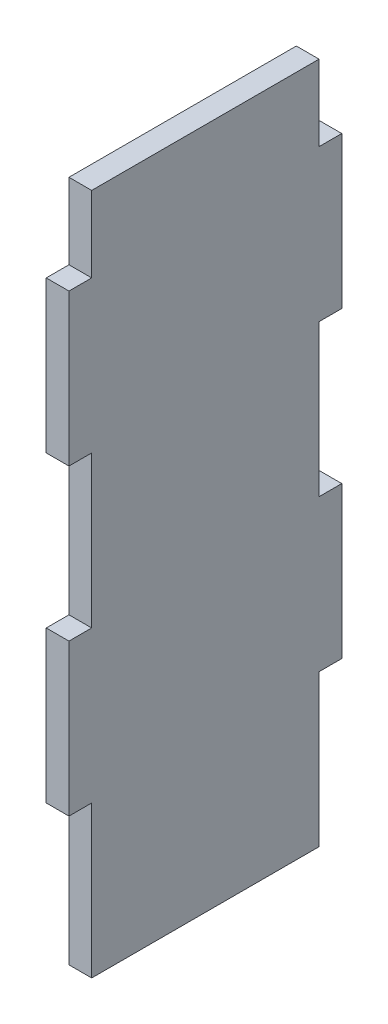
ISO-10303-21;
HEADER;
FILE_DESCRIPTION(('STEP AP214'),'2;1');
FILE_NAME('part.step','',(''),(''),'','','');
FILE_SCHEMA(('AUTOMOTIVE_DESIGN { 1 0 10303 214 1 1 1 1 }'));
ENDSEC;
DATA;
#1=APPLICATION_CONTEXT('core data for automotive mechanical design processes');
#2=APPLICATION_PROTOCOL_DEFINITION('international standard','automotive_design',2000,#1);
#3=PRODUCT_CONTEXT('',#1,'mechanical');
#4=PRODUCT('Part','Part','',(#3));
#5=PRODUCT_RELATED_PRODUCT_CATEGORY('part','',(#4));
#6=PRODUCT_DEFINITION_FORMATION('','',#4);
#7=PRODUCT_DEFINITION_CONTEXT('part definition',#1,'design');
#8=PRODUCT_DEFINITION('design','',#6,#7);
#9=PRODUCT_DEFINITION_SHAPE('','',#8);
#10=(LENGTH_UNIT() NAMED_UNIT(*) SI_UNIT(.MILLI.,.METRE.));
#11=(NAMED_UNIT(*) PLANE_ANGLE_UNIT() SI_UNIT($,.RADIAN.));
#12=(NAMED_UNIT(*) SI_UNIT($,.STERADIAN.) SOLID_ANGLE_UNIT());
#13=UNCERTAINTY_MEASURE_WITH_UNIT(LENGTH_MEASURE(1.E-05),#10,'distance_accuracy_value','');
#14=(GEOMETRIC_REPRESENTATION_CONTEXT(3) GLOBAL_UNCERTAINTY_ASSIGNED_CONTEXT((#13)) GLOBAL_UNIT_ASSIGNED_CONTEXT((#10,
#11,#12)) REPRESENTATION_CONTEXT('',''));
#15=CARTESIAN_POINT('',(0.,0.,0.));
#16=DIRECTION('',(0.,0.,1.));
#17=DIRECTION('',(1.,0.,0.));
#18=AXIS2_PLACEMENT_3D('',#15,#16,#17);
#19=CARTESIAN_POINT('',(3.,0.,-15.));
#20=DIRECTION('',(0.,0.,1.));
#21=DIRECTION('',(1.,0.,0.));
#22=AXIS2_PLACEMENT_3D('',#19,#20,#21);
#23=PLANE('',#22);
#24=DIRECTION('',(0.,1.,0.));
#25=VECTOR('',#24,1.);
#26=CARTESIAN_POINT('',(0.,0.,-15.));
#27=LINE('',#26,#25);
#28=CARTESIAN_POINT('',(0.,0.,-15.));
#29=VERTEX_POINT('',#28);
#30=CARTESIAN_POINT('',(0.,20.,-15.));
#31=VERTEX_POINT('',#30);
#32=EDGE_CURVE('E203',#29,#31,#27,.T.);
#33=ORIENTED_EDGE('',*,*,#32,.T.);
#34=DIRECTION('',(-1.,0.,0.));
#35=VECTOR('',#34,1.);
#36=CARTESIAN_POINT('',(3.,20.,-15.));
#37=LINE('',#36,#35);
#38=CARTESIAN_POINT('',(3.,20.,-15.));
#39=VERTEX_POINT('',#38);
#40=EDGE_CURVE('E11',#39,#31,#37,.T.);
#41=ORIENTED_EDGE('',*,*,#40,.F.);
#42=DIRECTION('',(0.,1.,0.));
#43=VECTOR('',#42,1.);
#44=CARTESIAN_POINT('',(3.,0.,-15.));
#45=LINE('',#44,#43);
#46=CARTESIAN_POINT('',(3.,0.,-15.));
#47=VERTEX_POINT('',#46);
#48=EDGE_CURVE('E241',#47,#39,#45,.T.);
#49=ORIENTED_EDGE('',*,*,#48,.F.);
#50=DIRECTION('',(-1.,0.,0.));
#51=VECTOR('',#50,1.);
#52=CARTESIAN_POINT('',(3.,0.,-15.));
#53=LINE('',#52,#51);
#54=EDGE_CURVE('E199',#47,#29,#53,.T.);
#55=ORIENTED_EDGE('',*,*,#54,.T.);
#56=EDGE_LOOP('',(#33,#41,#49,#55));
#57=FACE_BOUND('',#56,.T.);
#58=ADVANCED_FACE('F35',(#57),#23,.F.);
#59=CARTESIAN_POINT('',(3.,20.,-15.));
#60=DIRECTION('',(0.,1.,0.));
#61=DIRECTION('',(0.,0.,1.));
#62=AXIS2_PLACEMENT_3D('',#59,#60,#61);
#63=PLANE('',#62);
#64=DIRECTION('',(0.,0.,-1.));
#65=VECTOR('',#64,1.);
#66=CARTESIAN_POINT('',(0.,20.,-15.));
#67=LINE('',#66,#65);
#68=CARTESIAN_POINT('',(0.,20.,-18.));
#69=VERTEX_POINT('',#68);
#70=EDGE_CURVE('E206',#31,#69,#67,.T.);
#71=ORIENTED_EDGE('',*,*,#70,.T.);
#72=DIRECTION('',(-1.,0.,0.));
#73=VECTOR('',#72,1.);
#74=CARTESIAN_POINT('',(3.,20.,-18.));
#75=LINE('',#74,#73);
#76=CARTESIAN_POINT('',(3.,20.,-18.));
#77=VERTEX_POINT('',#76);
#78=EDGE_CURVE('E43',#77,#69,#75,.T.);
#79=ORIENTED_EDGE('',*,*,#78,.F.);
#80=DIRECTION('',(0.,0.,-1.));
#81=VECTOR('',#80,1.);
#82=CARTESIAN_POINT('',(3.,20.,-15.));
#83=LINE('',#82,#81);
#84=EDGE_CURVE('E130',#39,#77,#83,.T.);
#85=ORIENTED_EDGE('',*,*,#84,.F.);
#86=ORIENTED_EDGE('',*,*,#40,.T.);
#87=EDGE_LOOP('',(#71,#79,#85,#86));
#88=FACE_BOUND('',#87,.T.);
#89=ADVANCED_FACE('F359',(#88),#63,.F.);
#90=CARTESIAN_POINT('',(3.,20.,-18.));
#91=DIRECTION('',(0.,0.,1.));
#92=DIRECTION('',(1.,0.,0.));
#93=AXIS2_PLACEMENT_3D('',#90,#91,#92);
#94=PLANE('',#93);
#95=DIRECTION('',(0.,1.,0.));
#96=VECTOR('',#95,1.);
#97=CARTESIAN_POINT('',(0.,20.,-18.));
#98=LINE('',#97,#96);
#99=CARTESIAN_POINT('',(0.,40.,-18.));
#100=VERTEX_POINT('',#99);
#101=EDGE_CURVE('E208',#69,#100,#98,.T.);
#102=ORIENTED_EDGE('',*,*,#101,.T.);
#103=DIRECTION('',(-1.,0.,0.));
#104=VECTOR('',#103,1.);
#105=CARTESIAN_POINT('',(3.,40.,-18.));
#106=LINE('',#105,#104);
#107=CARTESIAN_POINT('',(3.,40.,-18.));
#108=VERTEX_POINT('',#107);
#109=EDGE_CURVE('E284',#108,#100,#106,.T.);
#110=ORIENTED_EDGE('',*,*,#109,.F.);
#111=DIRECTION('',(0.,1.,0.));
#112=VECTOR('',#111,1.);
#113=CARTESIAN_POINT('',(3.,20.,-18.));
#114=LINE('',#113,#112);
#115=EDGE_CURVE('E292',#77,#108,#114,.T.);
#116=ORIENTED_EDGE('',*,*,#115,.F.);
#117=ORIENTED_EDGE('',*,*,#78,.T.);
#118=EDGE_LOOP('',(#102,#110,#116,#117));
#119=FACE_BOUND('',#118,.T.);
#120=ADVANCED_FACE('F290',(#119),#94,.F.);
#121=CARTESIAN_POINT('',(3.,40.,-18.));
#122=DIRECTION('',(0.,-1.,0.));
#123=DIRECTION('',(0.,0.,-1.));
#124=AXIS2_PLACEMENT_3D('',#121,#122,#123);
#125=PLANE('',#124);
#126=DIRECTION('',(0.,0.,1.));
#127=VECTOR('',#126,1.);
#128=CARTESIAN_POINT('',(0.,40.,-18.));
#129=LINE('',#128,#127);
#130=CARTESIAN_POINT('',(0.,40.,-15.));
#131=VERTEX_POINT('',#130);
#132=EDGE_CURVE('E210',#100,#131,#129,.T.);
#133=ORIENTED_EDGE('',*,*,#132,.T.);
#134=DIRECTION('',(-1.,0.,0.));
#135=VECTOR('',#134,1.);
#136=CARTESIAN_POINT('',(3.,40.,-15.));
#137=LINE('',#136,#135);
#138=CARTESIAN_POINT('',(3.,40.,-15.));
#139=VERTEX_POINT('',#138);
#140=EDGE_CURVE('E281',#139,#131,#137,.T.);
#141=ORIENTED_EDGE('',*,*,#140,.F.);
#142=DIRECTION('',(0.,0.,1.));
#143=VECTOR('',#142,1.);
#144=CARTESIAN_POINT('',(3.,40.,-18.));
#145=LINE('',#144,#143);
#146=EDGE_CURVE('E310',#108,#139,#145,.T.);
#147=ORIENTED_EDGE('',*,*,#146,.F.);
#148=ORIENTED_EDGE('',*,*,#109,.T.);
#149=EDGE_LOOP('',(#133,#141,#147,#148));
#150=FACE_BOUND('',#149,.T.);
#151=ADVANCED_FACE('F301',(#150),#125,.F.);
#152=CARTESIAN_POINT('',(3.,40.,-15.));
#153=DIRECTION('',(0.,0.,1.));
#154=DIRECTION('',(0.,-1.,0.));
#155=AXIS2_PLACEMENT_3D('',#152,#153,#154);
#156=PLANE('',#155);
#157=DIRECTION('',(0.,1.,0.));
#158=VECTOR('',#157,1.);
#159=CARTESIAN_POINT('',(0.,40.,-15.));
#160=LINE('',#159,#158);
#161=CARTESIAN_POINT('',(0.,60.,-15.));
#162=VERTEX_POINT('',#161);
#163=EDGE_CURVE('E212',#131,#162,#160,.T.);
#164=ORIENTED_EDGE('',*,*,#163,.T.);
#165=DIRECTION('',(-1.,0.,0.));
#166=VECTOR('',#165,1.);
#167=CARTESIAN_POINT('',(3.,60.,-15.));
#168=LINE('',#167,#166);
#169=CARTESIAN_POINT('',(3.,60.,-15.));
#170=VERTEX_POINT('',#169);
#171=EDGE_CURVE('E278',#170,#162,#168,.T.);
#172=ORIENTED_EDGE('',*,*,#171,.F.);
#173=DIRECTION('',(0.,1.,0.));
#174=VECTOR('',#173,1.);
#175=CARTESIAN_POINT('',(3.,40.,-15.));
#176=LINE('',#175,#174);
#177=EDGE_CURVE('E307',#139,#170,#176,.T.);
#178=ORIENTED_EDGE('',*,*,#177,.F.);
#179=ORIENTED_EDGE('',*,*,#140,.T.);
#180=EDGE_LOOP('',(#164,#172,#178,#179));
#181=FACE_BOUND('',#180,.T.);
#182=ADVANCED_FACE('F305',(#181),#156,.F.);
#183=CARTESIAN_POINT('',(3.,60.,-15.));
#184=DIRECTION('',(0.,1.,0.));
#185=DIRECTION('',(0.,0.,1.));
#186=AXIS2_PLACEMENT_3D('',#183,#184,#185);
#187=PLANE('',#186);
#188=DIRECTION('',(0.,0.,-1.));
#189=VECTOR('',#188,1.);
#190=CARTESIAN_POINT('',(0.,60.,-15.));
#191=LINE('',#190,#189);
#192=CARTESIAN_POINT('',(0.,60.,-18.));
#193=VERTEX_POINT('',#192);
#194=EDGE_CURVE('E214',#162,#193,#191,.T.);
#195=ORIENTED_EDGE('',*,*,#194,.T.);
#196=DIRECTION('',(-1.,0.,0.));
#197=VECTOR('',#196,1.);
#198=CARTESIAN_POINT('',(3.,60.,-18.));
#199=LINE('',#198,#197);
#200=CARTESIAN_POINT('',(3.,60.,-18.));
#201=VERTEX_POINT('',#200);
#202=EDGE_CURVE('E275',#201,#193,#199,.T.);
#203=ORIENTED_EDGE('',*,*,#202,.F.);
#204=DIRECTION('',(0.,0.,-1.));
#205=VECTOR('',#204,1.);
#206=CARTESIAN_POINT('',(3.,60.,-15.));
#207=LINE('',#206,#205);
#208=EDGE_CURVE('E309',#170,#201,#207,.T.);
#209=ORIENTED_EDGE('',*,*,#208,.F.);
#210=ORIENTED_EDGE('',*,*,#171,.T.);
#211=EDGE_LOOP('',(#195,#203,#209,#210));
#212=FACE_BOUND('',#211,.T.);
#213=ADVANCED_FACE('F372',(#212),#187,.F.);
#214=CARTESIAN_POINT('',(3.,60.,-18.));
#215=DIRECTION('',(0.,0.,1.));
#216=DIRECTION('',(1.,0.,0.));
#217=AXIS2_PLACEMENT_3D('',#214,#215,#216);
#218=PLANE('',#217);
#219=DIRECTION('',(0.,1.,0.));
#220=VECTOR('',#219,1.);
#221=CARTESIAN_POINT('',(0.,60.,-18.));
#222=LINE('',#221,#220);
#223=CARTESIAN_POINT('',(0.,80.,-18.));
#224=VERTEX_POINT('',#223);
#225=EDGE_CURVE('E216',#193,#224,#222,.T.);
#226=ORIENTED_EDGE('',*,*,#225,.T.);
#227=DIRECTION('',(-1.,0.,0.));
#228=VECTOR('',#227,1.);
#229=CARTESIAN_POINT('',(3.,80.,-18.));
#230=LINE('',#229,#228);
#231=CARTESIAN_POINT('',(3.,80.,-18.));
#232=VERTEX_POINT('',#231);
#233=EDGE_CURVE('E272',#232,#224,#230,.T.);
#234=ORIENTED_EDGE('',*,*,#233,.F.);
#235=DIRECTION('',(0.,1.,0.));
#236=VECTOR('',#235,1.);
#237=CARTESIAN_POINT('',(3.,60.,-18.));
#238=LINE('',#237,#236);
#239=EDGE_CURVE('E312',#201,#232,#238,.T.);
#240=ORIENTED_EDGE('',*,*,#239,.F.);
#241=ORIENTED_EDGE('',*,*,#202,.T.);
#242=EDGE_LOOP('',(#226,#234,#240,#241));
#243=FACE_BOUND('',#242,.T.);
#244=ADVANCED_FACE('F375',(#243),#218,.F.);
#245=CARTESIAN_POINT('',(3.,80.,-18.));
#246=DIRECTION('',(0.,-1.,0.));
#247=DIRECTION('',(0.,0.,-1.));
#248=AXIS2_PLACEMENT_3D('',#245,#246,#247);
#249=PLANE('',#248);
#250=DIRECTION('',(0.,0.,1.));
#251=VECTOR('',#250,1.);
#252=CARTESIAN_POINT('',(0.,80.,-18.));
#253=LINE('',#252,#251);
#254=CARTESIAN_POINT('',(0.,80.,-15.));
#255=VERTEX_POINT('',#254);
#256=EDGE_CURVE('E218',#224,#255,#253,.T.);
#257=ORIENTED_EDGE('',*,*,#256,.T.);
#258=DIRECTION('',(-1.,0.,0.));
#259=VECTOR('',#258,1.);
#260=CARTESIAN_POINT('',(3.,80.,-15.));
#261=LINE('',#260,#259);
#262=CARTESIAN_POINT('',(3.,80.,-15.));
#263=VERTEX_POINT('',#262);
#264=EDGE_CURVE('E269',#263,#255,#261,.T.);
#265=ORIENTED_EDGE('',*,*,#264,.F.);
#266=DIRECTION('',(0.,0.,1.));
#267=VECTOR('',#266,1.);
#268=CARTESIAN_POINT('',(3.,80.,-18.));
#269=LINE('',#268,#267);
#270=EDGE_CURVE('E318',#232,#263,#269,.T.);
#271=ORIENTED_EDGE('',*,*,#270,.F.);
#272=ORIENTED_EDGE('',*,*,#233,.T.);
#273=EDGE_LOOP('',(#257,#265,#271,#272));
#274=FACE_BOUND('',#273,.T.);
#275=ADVANCED_FACE('F379',(#274),#249,.F.);
#276=CARTESIAN_POINT('',(3.,80.,-15.));
#277=DIRECTION('',(0.,0.,1.));
#278=DIRECTION('',(0.,-1.,0.));
#279=AXIS2_PLACEMENT_3D('',#276,#277,#278);
#280=PLANE('',#279);
#281=DIRECTION('',(0.,1.,0.));
#282=VECTOR('',#281,1.);
#283=CARTESIAN_POINT('',(0.,80.,-15.));
#284=LINE('',#283,#282);
#285=CARTESIAN_POINT('',(0.,90.,-15.));
#286=VERTEX_POINT('',#285);
#287=EDGE_CURVE('E220',#255,#286,#284,.T.);
#288=ORIENTED_EDGE('',*,*,#287,.T.);
#289=DIRECTION('',(-1.,0.,0.));
#290=VECTOR('',#289,1.);
#291=CARTESIAN_POINT('',(3.,90.,-15.));
#292=LINE('',#291,#290);
#293=CARTESIAN_POINT('',(3.,90.,-15.));
#294=VERTEX_POINT('',#293);
#295=EDGE_CURVE('E266',#294,#286,#292,.T.);
#296=ORIENTED_EDGE('',*,*,#295,.F.);
#297=DIRECTION('',(0.,1.,0.));
#298=VECTOR('',#297,1.);
#299=CARTESIAN_POINT('',(3.,80.,-15.));
#300=LINE('',#299,#298);
#301=EDGE_CURVE('E320',#263,#294,#300,.T.);
#302=ORIENTED_EDGE('',*,*,#301,.F.);
#303=ORIENTED_EDGE('',*,*,#264,.T.);
#304=EDGE_LOOP('',(#288,#296,#302,#303));
#305=FACE_BOUND('',#304,.T.);
#306=ADVANCED_FACE('F383',(#305),#280,.F.);
#307=CARTESIAN_POINT('',(3.,90.,-15.));
#308=DIRECTION('',(0.,-1.,0.));
#309=DIRECTION('',(0.,0.,-1.));
#310=AXIS2_PLACEMENT_3D('',#307,#308,#309);
#311=PLANE('',#310);
#312=DIRECTION('',(0.,0.,1.));
#313=VECTOR('',#312,1.);
#314=CARTESIAN_POINT('',(0.,90.,-15.));
#315=LINE('',#314,#313);
#316=CARTESIAN_POINT('',(0.,90.,15.));
#317=VERTEX_POINT('',#316);
#318=EDGE_CURVE('E222',#286,#317,#315,.T.);
#319=ORIENTED_EDGE('',*,*,#318,.T.);
#320=DIRECTION('',(-1.,0.,0.));
#321=VECTOR('',#320,1.);
#322=CARTESIAN_POINT('',(3.,90.,15.));
#323=LINE('',#322,#321);
#324=CARTESIAN_POINT('',(3.,90.,15.));
#325=VERTEX_POINT('',#324);
#326=EDGE_CURVE('E263',#325,#317,#323,.T.);
#327=ORIENTED_EDGE('',*,*,#326,.F.);
#328=DIRECTION('',(0.,0.,1.));
#329=VECTOR('',#328,1.);
#330=CARTESIAN_POINT('',(3.,90.,-15.));
#331=LINE('',#330,#329);
#332=EDGE_CURVE('E322',#294,#325,#331,.T.);
#333=ORIENTED_EDGE('',*,*,#332,.F.);
#334=ORIENTED_EDGE('',*,*,#295,.T.);
#335=EDGE_LOOP('',(#319,#327,#333,#334));
#336=FACE_BOUND('',#335,.T.);
#337=ADVANCED_FACE('F387',(#336),#311,.F.);
#338=CARTESIAN_POINT('',(3.,80.,15.));
#339=DIRECTION('',(0.,0.,-1.));
#340=DIRECTION('',(0.,1.,0.));
#341=AXIS2_PLACEMENT_3D('',#338,#339,#340);
#342=PLANE('',#341);
#343=DIRECTION('',(0.,-1.,0.));
#344=VECTOR('',#343,1.);
#345=CARTESIAN_POINT('',(0.,80.,15.));
#346=LINE('',#345,#344);
#347=CARTESIAN_POINT('',(0.,80.,15.));
#348=VERTEX_POINT('',#347);
#349=EDGE_CURVE('E224',#317,#348,#346,.T.);
#350=ORIENTED_EDGE('',*,*,#349,.T.);
#351=DIRECTION('',(-1.,0.,0.));
#352=VECTOR('',#351,1.);
#353=CARTESIAN_POINT('',(3.,80.,15.));
#354=LINE('',#353,#352);
#355=CARTESIAN_POINT('',(3.,80.,15.));
#356=VERTEX_POINT('',#355);
#357=EDGE_CURVE('E260',#356,#348,#354,.T.);
#358=ORIENTED_EDGE('',*,*,#357,.F.);
#359=DIRECTION('',(0.,-1.,0.));
#360=VECTOR('',#359,1.);
#361=CARTESIAN_POINT('',(3.,80.,15.));
#362=LINE('',#361,#360);
#363=EDGE_CURVE('E324',#325,#356,#362,.T.);
#364=ORIENTED_EDGE('',*,*,#363,.F.);
#365=ORIENTED_EDGE('',*,*,#326,.T.);
#366=EDGE_LOOP('',(#350,#358,#364,#365));
#367=FACE_BOUND('',#366,.T.);
#368=ADVANCED_FACE('F391',(#367),#342,.F.);
#369=CARTESIAN_POINT('',(3.,80.,18.));
#370=DIRECTION('',(0.,-1.,0.));
#371=DIRECTION('',(0.,0.,-1.));
#372=AXIS2_PLACEMENT_3D('',#369,#370,#371);
#373=PLANE('',#372);
#374=DIRECTION('',(0.,0.,1.));
#375=VECTOR('',#374,1.);
#376=CARTESIAN_POINT('',(0.,80.,18.));
#377=LINE('',#376,#375);
#378=CARTESIAN_POINT('',(0.,80.,18.));
#379=VERTEX_POINT('',#378);
#380=EDGE_CURVE('E226',#348,#379,#377,.T.);
#381=ORIENTED_EDGE('',*,*,#380,.T.);
#382=DIRECTION('',(-1.,0.,0.));
#383=VECTOR('',#382,1.);
#384=CARTESIAN_POINT('',(3.,80.,18.));
#385=LINE('',#384,#383);
#386=CARTESIAN_POINT('',(3.,80.,18.));
#387=VERTEX_POINT('',#386);
#388=EDGE_CURVE('E257',#387,#379,#385,.T.);
#389=ORIENTED_EDGE('',*,*,#388,.F.);
#390=DIRECTION('',(0.,0.,1.));
#391=VECTOR('',#390,1.);
#392=CARTESIAN_POINT('',(3.,80.,18.));
#393=LINE('',#392,#391);
#394=EDGE_CURVE('E326',#356,#387,#393,.T.);
#395=ORIENTED_EDGE('',*,*,#394,.F.);
#396=ORIENTED_EDGE('',*,*,#357,.T.);
#397=EDGE_LOOP('',(#381,#389,#395,#396));
#398=FACE_BOUND('',#397,.T.);
#399=ADVANCED_FACE('F395',(#398),#373,.F.);
#400=CARTESIAN_POINT('',(3.,60.,18.));
#401=DIRECTION('',(0.,0.,-1.));
#402=DIRECTION('',(-1.,0.,0.));
#403=AXIS2_PLACEMENT_3D('',#400,#401,#402);
#404=PLANE('',#403);
#405=DIRECTION('',(0.,-1.,0.));
#406=VECTOR('',#405,1.);
#407=CARTESIAN_POINT('',(0.,60.,18.));
#408=LINE('',#407,#406);
#409=CARTESIAN_POINT('',(0.,60.,18.));
#410=VERTEX_POINT('',#409);
#411=EDGE_CURVE('E228',#379,#410,#408,.T.);
#412=ORIENTED_EDGE('',*,*,#411,.T.);
#413=DIRECTION('',(-1.,0.,0.));
#414=VECTOR('',#413,1.);
#415=CARTESIAN_POINT('',(3.,60.,18.));
#416=LINE('',#415,#414);
#417=CARTESIAN_POINT('',(3.,60.,18.));
#418=VERTEX_POINT('',#417);
#419=EDGE_CURVE('E254',#418,#410,#416,.T.);
#420=ORIENTED_EDGE('',*,*,#419,.F.);
#421=DIRECTION('',(0.,-1.,0.));
#422=VECTOR('',#421,1.);
#423=CARTESIAN_POINT('',(3.,60.,18.));
#424=LINE('',#423,#422);
#425=EDGE_CURVE('E328',#387,#418,#424,.T.);
#426=ORIENTED_EDGE('',*,*,#425,.F.);
#427=ORIENTED_EDGE('',*,*,#388,.T.);
#428=EDGE_LOOP('',(#412,#420,#426,#427));
#429=FACE_BOUND('',#428,.T.);
#430=ADVANCED_FACE('F399',(#429),#404,.F.);
#431=CARTESIAN_POINT('',(3.,60.,15.));
#432=DIRECTION('',(0.,1.,0.));
#433=DIRECTION('',(0.,0.,1.));
#434=AXIS2_PLACEMENT_3D('',#431,#432,#433);
#435=PLANE('',#434);
#436=DIRECTION('',(0.,0.,-1.));
#437=VECTOR('',#436,1.);
#438=CARTESIAN_POINT('',(0.,60.,15.));
#439=LINE('',#438,#437);
#440=CARTESIAN_POINT('',(0.,60.,15.));
#441=VERTEX_POINT('',#440);
#442=EDGE_CURVE('E230',#410,#441,#439,.T.);
#443=ORIENTED_EDGE('',*,*,#442,.T.);
#444=DIRECTION('',(-1.,0.,0.));
#445=VECTOR('',#444,1.);
#446=CARTESIAN_POINT('',(3.,60.,15.));
#447=LINE('',#446,#445);
#448=CARTESIAN_POINT('',(3.,60.,15.));
#449=VERTEX_POINT('',#448);
#450=EDGE_CURVE('E251',#449,#441,#447,.T.);
#451=ORIENTED_EDGE('',*,*,#450,.F.);
#452=DIRECTION('',(0.,0.,-1.));
#453=VECTOR('',#452,1.);
#454=CARTESIAN_POINT('',(3.,60.,15.));
#455=LINE('',#454,#453);
#456=EDGE_CURVE('E330',#418,#449,#455,.T.);
#457=ORIENTED_EDGE('',*,*,#456,.F.);
#458=ORIENTED_EDGE('',*,*,#419,.T.);
#459=EDGE_LOOP('',(#443,#451,#457,#458));
#460=FACE_BOUND('',#459,.T.);
#461=ADVANCED_FACE('F403',(#460),#435,.F.);
#462=CARTESIAN_POINT('',(3.,40.,15.));
#463=DIRECTION('',(0.,0.,-1.));
#464=DIRECTION('',(0.,1.,0.));
#465=AXIS2_PLACEMENT_3D('',#462,#463,#464);
#466=PLANE('',#465);
#467=DIRECTION('',(0.,-1.,0.));
#468=VECTOR('',#467,1.);
#469=CARTESIAN_POINT('',(0.,40.,15.));
#470=LINE('',#469,#468);
#471=CARTESIAN_POINT('',(0.,40.,15.));
#472=VERTEX_POINT('',#471);
#473=EDGE_CURVE('E232',#441,#472,#470,.T.);
#474=ORIENTED_EDGE('',*,*,#473,.T.);
#475=DIRECTION('',(-1.,0.,0.));
#476=VECTOR('',#475,1.);
#477=CARTESIAN_POINT('',(3.,40.,15.));
#478=LINE('',#477,#476);
#479=CARTESIAN_POINT('',(3.,40.,15.));
#480=VERTEX_POINT('',#479);
#481=EDGE_CURVE('E248',#480,#472,#478,.T.);
#482=ORIENTED_EDGE('',*,*,#481,.F.);
#483=DIRECTION('',(0.,-1.,0.));
#484=VECTOR('',#483,1.);
#485=CARTESIAN_POINT('',(3.,40.,15.));
#486=LINE('',#485,#484);
#487=EDGE_CURVE('E332',#449,#480,#486,.T.);
#488=ORIENTED_EDGE('',*,*,#487,.F.);
#489=ORIENTED_EDGE('',*,*,#450,.T.);
#490=EDGE_LOOP('',(#474,#482,#488,#489));
#491=FACE_BOUND('',#490,.T.);
#492=ADVANCED_FACE('F407',(#491),#466,.F.);
#493=CARTESIAN_POINT('',(3.,40.,18.));
#494=DIRECTION('',(0.,-1.,0.));
#495=DIRECTION('',(0.,0.,-1.));
#496=AXIS2_PLACEMENT_3D('',#493,#494,#495);
#497=PLANE('',#496);
#498=DIRECTION('',(0.,0.,1.));
#499=VECTOR('',#498,1.);
#500=CARTESIAN_POINT('',(0.,40.,18.));
#501=LINE('',#500,#499);
#502=CARTESIAN_POINT('',(0.,40.,18.));
#503=VERTEX_POINT('',#502);
#504=EDGE_CURVE('E234',#472,#503,#501,.T.);
#505=ORIENTED_EDGE('',*,*,#504,.T.);
#506=DIRECTION('',(-1.,0.,0.));
#507=VECTOR('',#506,1.);
#508=CARTESIAN_POINT('',(3.,40.,18.));
#509=LINE('',#508,#507);
#510=CARTESIAN_POINT('',(3.,40.,18.));
#511=VERTEX_POINT('',#510);
#512=EDGE_CURVE('E245',#511,#503,#509,.T.);
#513=ORIENTED_EDGE('',*,*,#512,.F.);
#514=DIRECTION('',(0.,0.,1.));
#515=VECTOR('',#514,1.);
#516=CARTESIAN_POINT('',(3.,40.,18.));
#517=LINE('',#516,#515);
#518=EDGE_CURVE('E334',#480,#511,#517,.T.);
#519=ORIENTED_EDGE('',*,*,#518,.F.);
#520=ORIENTED_EDGE('',*,*,#481,.T.);
#521=EDGE_LOOP('',(#505,#513,#519,#520));
#522=FACE_BOUND('',#521,.T.);
#523=ADVANCED_FACE('F340',(#522),#497,.F.);
#524=CARTESIAN_POINT('',(3.,20.0000000000001,18.));
#525=DIRECTION('',(0.,0.,-1.));
#526=DIRECTION('',(-1.,0.,0.));
#527=AXIS2_PLACEMENT_3D('',#524,#525,#526);
#528=PLANE('',#527);
#529=DIRECTION('',(0.,-1.,0.));
#530=VECTOR('',#529,1.);
#531=CARTESIAN_POINT('',(0.,20.0000000000001,18.));
#532=LINE('',#531,#530);
#533=CARTESIAN_POINT('',(0.,20.0000000000001,18.));
#534=VERTEX_POINT('',#533);
#535=EDGE_CURVE('E236',#503,#534,#532,.T.);
#536=ORIENTED_EDGE('',*,*,#535,.T.);
#537=DIRECTION('',(-1.,0.,0.));
#538=VECTOR('',#537,1.);
#539=CARTESIAN_POINT('',(3.,20.0000000000001,18.));
#540=LINE('',#539,#538);
#541=CARTESIAN_POINT('',(3.,20.0000000000001,18.));
#542=VERTEX_POINT('',#541);
#543=EDGE_CURVE('E194',#542,#534,#540,.T.);
#544=ORIENTED_EDGE('',*,*,#543,.F.);
#545=DIRECTION('',(0.,-1.,0.));
#546=VECTOR('',#545,1.);
#547=CARTESIAN_POINT('',(3.,20.0000000000001,18.));
#548=LINE('',#547,#546);
#549=EDGE_CURVE('E185',#511,#542,#548,.T.);
#550=ORIENTED_EDGE('',*,*,#549,.F.);
#551=ORIENTED_EDGE('',*,*,#512,.T.);
#552=EDGE_LOOP('',(#536,#544,#550,#551));
#553=FACE_BOUND('',#552,.T.);
#554=ADVANCED_FACE('F344',(#553),#528,.F.);
#555=CARTESIAN_POINT('',(3.,20.0000000000001,15.));
#556=DIRECTION('',(0.,1.,0.));
#557=DIRECTION('',(0.,0.,1.));
#558=AXIS2_PLACEMENT_3D('',#555,#556,#557);
#559=PLANE('',#558);
#560=DIRECTION('',(0.,0.,-1.));
#561=VECTOR('',#560,1.);
#562=CARTESIAN_POINT('',(0.,20.0000000000001,15.));
#563=LINE('',#562,#561);
#564=CARTESIAN_POINT('',(0.,20.0000000000001,15.));
#565=VERTEX_POINT('',#564);
#566=EDGE_CURVE('E193',#534,#565,#563,.T.);
#567=ORIENTED_EDGE('',*,*,#566,.T.);
#568=DIRECTION('',(-1.,0.,0.));
#569=VECTOR('',#568,1.);
#570=CARTESIAN_POINT('',(3.,20.0000000000001,15.));
#571=LINE('',#570,#569);
#572=CARTESIAN_POINT('',(3.,20.0000000000001,15.));
#573=VERTEX_POINT('',#572);
#574=EDGE_CURVE('E190',#573,#565,#571,.T.);
#575=ORIENTED_EDGE('',*,*,#574,.F.);
#576=DIRECTION('',(0.,0.,-1.));
#577=VECTOR('',#576,1.);
#578=CARTESIAN_POINT('',(3.,20.0000000000001,15.));
#579=LINE('',#578,#577);
#580=EDGE_CURVE('E179',#542,#573,#579,.T.);
#581=ORIENTED_EDGE('',*,*,#580,.F.);
#582=ORIENTED_EDGE('',*,*,#543,.T.);
#583=EDGE_LOOP('',(#567,#575,#581,#582));
#584=FACE_BOUND('',#583,.T.);
#585=ADVANCED_FACE('F191',(#584),#559,.F.);
#586=CARTESIAN_POINT('',(3.,0.,15.));
#587=DIRECTION('',(0.,0.,-1.));
#588=DIRECTION('',(-1.,0.,0.));
#589=AXIS2_PLACEMENT_3D('',#586,#587,#588);
#590=PLANE('',#589);
#591=DIRECTION('',(0.,-1.,0.));
#592=VECTOR('',#591,1.);
#593=CARTESIAN_POINT('',(0.,0.,15.));
#594=LINE('',#593,#592);
#595=CARTESIAN_POINT('',(0.,0.,15.));
#596=VERTEX_POINT('',#595);
#597=EDGE_CURVE('E116',#565,#596,#594,.T.);
#598=ORIENTED_EDGE('',*,*,#597,.T.);
#599=DIRECTION('',(-1.,0.,0.));
#600=VECTOR('',#599,1.);
#601=CARTESIAN_POINT('',(3.,0.,15.));
#602=LINE('',#601,#600);
#603=CARTESIAN_POINT('',(3.,0.,15.));
#604=VERTEX_POINT('',#603);
#605=EDGE_CURVE('E195',#604,#596,#602,.T.);
#606=ORIENTED_EDGE('',*,*,#605,.F.);
#607=DIRECTION('',(0.,-1.,0.));
#608=VECTOR('',#607,1.);
#609=CARTESIAN_POINT('',(3.,0.,15.));
#610=LINE('',#609,#608);
#611=EDGE_CURVE('E183',#573,#604,#610,.T.);
#612=ORIENTED_EDGE('',*,*,#611,.F.);
#613=ORIENTED_EDGE('',*,*,#574,.T.);
#614=EDGE_LOOP('',(#598,#606,#612,#613));
#615=FACE_BOUND('',#614,.T.);
#616=ADVANCED_FACE('F197',(#615),#590,.F.);
#617=CARTESIAN_POINT('',(3.,0.,15.));
#618=DIRECTION('',(0.,1.,0.));
#619=DIRECTION('',(0.,0.,1.));
#620=AXIS2_PLACEMENT_3D('',#617,#618,#619);
#621=PLANE('',#620);
#622=DIRECTION('',(0.,0.,-1.));
#623=VECTOR('',#622,1.);
#624=CARTESIAN_POINT('',(0.,0.,15.));
#625=LINE('',#624,#623);
#626=EDGE_CURVE('E122',#596,#29,#625,.T.);
#627=ORIENTED_EDGE('',*,*,#626,.T.);
#628=ORIENTED_EDGE('',*,*,#54,.F.);
#629=DIRECTION('',(0.,0.,-1.));
#630=VECTOR('',#629,1.);
#631=CARTESIAN_POINT('',(3.,0.,15.));
#632=LINE('',#631,#630);
#633=EDGE_CURVE('E51',#604,#47,#632,.T.);
#634=ORIENTED_EDGE('',*,*,#633,.F.);
#635=ORIENTED_EDGE('',*,*,#605,.T.);
#636=EDGE_LOOP('',(#627,#628,#634,#635));
#637=FACE_BOUND('',#636,.T.);
#638=ADVANCED_FACE('F348',(#637),#621,.F.);
#639=CARTESIAN_POINT('',(3.,0.,0.));
#640=DIRECTION('',(-1.,0.,0.));
#641=DIRECTION('',(0.,0.,1.));
#642=AXIS2_PLACEMENT_3D('',#639,#640,#641);
#643=PLANE('',#642);
#644=ORIENTED_EDGE('',*,*,#48,.T.);
#645=ORIENTED_EDGE('',*,*,#84,.T.);
#646=ORIENTED_EDGE('',*,*,#115,.T.);
#647=ORIENTED_EDGE('',*,*,#146,.T.);
#648=ORIENTED_EDGE('',*,*,#177,.T.);
#649=ORIENTED_EDGE('',*,*,#208,.T.);
#650=ORIENTED_EDGE('',*,*,#239,.T.);
#651=ORIENTED_EDGE('',*,*,#270,.T.);
#652=ORIENTED_EDGE('',*,*,#301,.T.);
#653=ORIENTED_EDGE('',*,*,#332,.T.);
#654=ORIENTED_EDGE('',*,*,#363,.T.);
#655=ORIENTED_EDGE('',*,*,#394,.T.);
#656=ORIENTED_EDGE('',*,*,#425,.T.);
#657=ORIENTED_EDGE('',*,*,#456,.T.);
#658=ORIENTED_EDGE('',*,*,#487,.T.);
#659=ORIENTED_EDGE('',*,*,#518,.T.);
#660=ORIENTED_EDGE('',*,*,#549,.T.);
#661=ORIENTED_EDGE('',*,*,#580,.T.);
#662=ORIENTED_EDGE('',*,*,#611,.T.);
#663=ORIENTED_EDGE('',*,*,#633,.T.);
#664=EDGE_LOOP('',(#644,#645,#646,#647,#648,#649,#650,#651,#652,#653,#654,#655,#656,#657,#658,
#659,#660,#661,#662,#663));
#665=FACE_BOUND('',#664,.T.);
#666=ADVANCED_FACE('F181',(#665),#643,.F.);
#667=CARTESIAN_POINT('',(0.,0.,0.));
#668=DIRECTION('',(-1.,0.,0.));
#669=DIRECTION('',(0.,0.,1.));
#670=AXIS2_PLACEMENT_3D('',#667,#668,#669);
#671=PLANE('',#670);
#672=ORIENTED_EDGE('',*,*,#32,.F.);
#673=ORIENTED_EDGE('',*,*,#626,.F.);
#674=ORIENTED_EDGE('',*,*,#597,.F.);
#675=ORIENTED_EDGE('',*,*,#566,.F.);
#676=ORIENTED_EDGE('',*,*,#535,.F.);
#677=ORIENTED_EDGE('',*,*,#504,.F.);
#678=ORIENTED_EDGE('',*,*,#473,.F.);
#679=ORIENTED_EDGE('',*,*,#442,.F.);
#680=ORIENTED_EDGE('',*,*,#411,.F.);
#681=ORIENTED_EDGE('',*,*,#380,.F.);
#682=ORIENTED_EDGE('',*,*,#349,.F.);
#683=ORIENTED_EDGE('',*,*,#318,.F.);
#684=ORIENTED_EDGE('',*,*,#287,.F.);
#685=ORIENTED_EDGE('',*,*,#256,.F.);
#686=ORIENTED_EDGE('',*,*,#225,.F.);
#687=ORIENTED_EDGE('',*,*,#194,.F.);
#688=ORIENTED_EDGE('',*,*,#163,.F.);
#689=ORIENTED_EDGE('',*,*,#132,.F.);
#690=ORIENTED_EDGE('',*,*,#101,.F.);
#691=ORIENTED_EDGE('',*,*,#70,.F.);
#692=EDGE_LOOP('',(#672,#673,#674,#675,#676,#677,#678,#679,#680,#681,#682,#683,#684,#685,#686,
#687,#688,#689,#690,#691));
#693=FACE_BOUND('',#692,.T.);
#694=ADVANCED_FACE('F296',(#693),#671,.T.);
#695=CLOSED_SHELL('',(#58,#89,#120,#151,#182,#213,#244,#275,#306,#337,#368,#399,#430,#461,#492,
#523,#554,#585,#616,#638,#666,#694));
#696=MANIFOLD_SOLID_BREP('B2',#695);
#697=ADVANCED_BREP_SHAPE_REPRESENTATION('',(#18,#696),#14);
#698=SHAPE_DEFINITION_REPRESENTATION(#9,#697);
ENDSEC;
END-ISO-10303-21;
